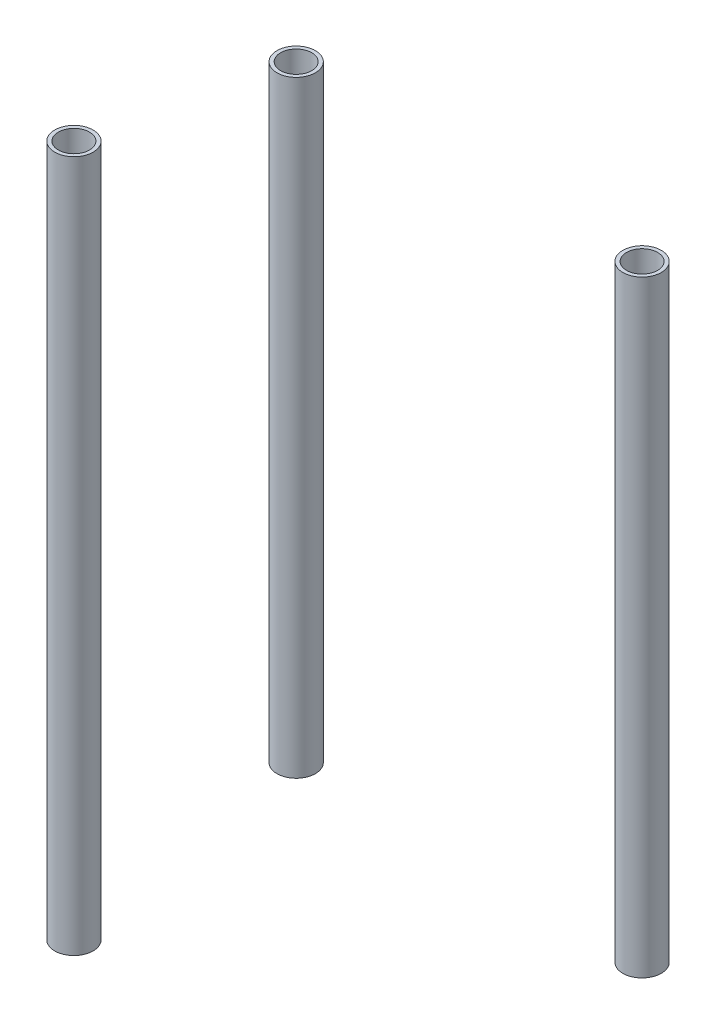
ISO-10303-21;
HEADER;
FILE_DESCRIPTION(('STEP AP214'),'2;1');
FILE_NAME('part.step','',(''),(''),'','','');
FILE_SCHEMA(('AUTOMOTIVE_DESIGN { 1 0 10303 214 1 1 1 1 }'));
ENDSEC;
DATA;
#1=APPLICATION_CONTEXT('core data for automotive mechanical design processes');
#2=APPLICATION_PROTOCOL_DEFINITION('international standard','automotive_design',2000,#1);
#3=PRODUCT_CONTEXT('',#1,'mechanical');
#4=PRODUCT('Part','Part','',(#3));
#5=PRODUCT_RELATED_PRODUCT_CATEGORY('part','',(#4));
#6=PRODUCT_DEFINITION_FORMATION('','',#4);
#7=PRODUCT_DEFINITION_CONTEXT('part definition',#1,'design');
#8=PRODUCT_DEFINITION('design','',#6,#7);
#9=PRODUCT_DEFINITION_SHAPE('','',#8);
#10=(LENGTH_UNIT() NAMED_UNIT(*) SI_UNIT(.MILLI.,.METRE.));
#11=(NAMED_UNIT(*) PLANE_ANGLE_UNIT() SI_UNIT($,.RADIAN.));
#12=(NAMED_UNIT(*) SI_UNIT($,.STERADIAN.) SOLID_ANGLE_UNIT());
#13=UNCERTAINTY_MEASURE_WITH_UNIT(LENGTH_MEASURE(1.E-05),#10,'distance_accuracy_value','');
#14=(GEOMETRIC_REPRESENTATION_CONTEXT(3) GLOBAL_UNCERTAINTY_ASSIGNED_CONTEXT((#13)) GLOBAL_UNIT_ASSIGNED_CONTEXT((#10,
#11,#12)) REPRESENTATION_CONTEXT('',''));
#15=CARTESIAN_POINT('',(0.,0.,0.));
#16=DIRECTION('',(0.,0.,1.));
#17=DIRECTION('',(1.,0.,0.));
#18=AXIS2_PLACEMENT_3D('',#15,#16,#17);
#19=CARTESIAN_POINT('',(-696.777536969202,-200.5838,15.6718));
#20=DIRECTION('',(0.,1.,0.));
#21=DIRECTION('',(0.,0.,1.));
#22=AXIS2_PLACEMENT_3D('',#19,#20,#21);
#23=CYLINDRICAL_SURFACE('',#22,10.287);
#24=CARTESIAN_POINT('',(-696.777536969202,-200.5838,15.6718));
#25=DIRECTION('',(0.,1.,0.));
#26=DIRECTION('',(0.,0.,1.));
#27=AXIS2_PLACEMENT_3D('',#24,#25,#26);
#28=CIRCLE('',#27,10.287);
#29=CARTESIAN_POINT('',(-696.777536969202,-200.5838,25.9588));
#30=VERTEX_POINT('',#29);
#31=EDGE_CURVE('E62',#30,#30,#28,.T.);
#32=CARTESIAN_POINT('',(-696.777536969202,200.5838,15.6718));
#33=DIRECTION('',(0.,1.,0.));
#34=DIRECTION('',(0.,0.,1.));
#35=AXIS2_PLACEMENT_3D('',#32,#33,#34);
#36=CIRCLE('',#35,10.287);
#37=CARTESIAN_POINT('',(-696.777536969202,200.5838,25.9587999999999));
#38=VERTEX_POINT('',#37);
#39=EDGE_CURVE('E68',#38,#38,#36,.T.);
#40=CARTESIAN_POINT('',(-696.777536969202,-200.5838,25.9588));
#41=CARTESIAN_POINT('',(-696.777536969202,-196.404970833333,25.9588));
#42=CARTESIAN_POINT('',(-696.777536969202,-192.226141666667,25.9588));
#43=CARTESIAN_POINT('',(-696.777536969202,-183.868483333333,25.9588));
#44=CARTESIAN_POINT('',(-696.777536969202,-179.689654166667,25.9588));
#45=CARTESIAN_POINT('',(-696.777536969202,-171.331995833333,25.9588));
#46=CARTESIAN_POINT('',(-696.777536969202,-167.153166666667,25.9588));
#47=CARTESIAN_POINT('',(-696.777536969202,-158.795508333333,25.9588));
#48=CARTESIAN_POINT('',(-696.777536969202,-154.616679166667,25.9588));
#49=CARTESIAN_POINT('',(-696.777536969202,-146.259020833333,25.9588));
#50=CARTESIAN_POINT('',(-696.777536969202,-142.080191666667,25.9588));
#51=CARTESIAN_POINT('',(-696.777536969202,-133.722533333333,25.9588));
#52=CARTESIAN_POINT('',(-696.777536969202,-129.543704166667,25.9588));
#53=CARTESIAN_POINT('',(-696.777536969202,-121.186045833333,25.9588));
#54=CARTESIAN_POINT('',(-696.777536969202,-117.007216666667,25.9588));
#55=CARTESIAN_POINT('',(-696.777536969202,-108.649558333333,25.9588));
#56=CARTESIAN_POINT('',(-696.777536969202,-104.470729166667,25.9588));
#57=CARTESIAN_POINT('',(-696.777536969202,-96.1130708333333,25.9588));
#58=CARTESIAN_POINT('',(-696.777536969202,-91.9342416666667,25.9588));
#59=CARTESIAN_POINT('',(-696.777536969202,-83.5765833333333,25.9588));
#60=CARTESIAN_POINT('',(-696.777536969202,-79.3977541666667,25.9588));
#61=CARTESIAN_POINT('',(-696.777536969202,-71.0400958333334,25.9588));
#62=CARTESIAN_POINT('',(-696.777536969202,-66.8612666666667,25.9588));
#63=CARTESIAN_POINT('',(-696.777536969202,-58.5036083333334,25.9588));
#64=CARTESIAN_POINT('',(-696.777536969202,-54.3247791666667,25.9588));
#65=CARTESIAN_POINT('',(-696.777536969202,-45.9671208333334,25.9588));
#66=CARTESIAN_POINT('',(-696.777536969202,-41.7882916666667,25.9588));
#67=CARTESIAN_POINT('',(-696.777536969202,-33.4306333333334,25.9588));
#68=CARTESIAN_POINT('',(-696.777536969202,-29.2518041666667,25.9588));
#69=CARTESIAN_POINT('',(-696.777536969202,-20.8941458333334,25.9588));
#70=CARTESIAN_POINT('',(-696.777536969202,-16.7153166666667,25.9588));
#71=CARTESIAN_POINT('',(-696.777536969202,-8.35765833333339,25.9588));
#72=CARTESIAN_POINT('',(-696.777536969202,-4.17882916666672,25.9588));
#73=CARTESIAN_POINT('',(-696.777536969202,4.17882916666661,25.9588));
#74=CARTESIAN_POINT('',(-696.777536969202,8.35765833333328,25.9588));
#75=CARTESIAN_POINT('',(-696.777536969202,16.7153166666666,25.9588));
#76=CARTESIAN_POINT('',(-696.777536969202,20.8941458333333,25.9588));
#77=CARTESIAN_POINT('',(-696.777536969202,29.2518041666666,25.9588));
#78=CARTESIAN_POINT('',(-696.777536969202,33.4306333333333,25.9588));
#79=CARTESIAN_POINT('',(-696.777536969202,41.7882916666666,25.9588));
#80=CARTESIAN_POINT('',(-696.777536969202,45.9671208333333,25.9588));
#81=CARTESIAN_POINT('',(-696.777536969202,54.3247791666666,25.9588));
#82=CARTESIAN_POINT('',(-696.777536969202,58.5036083333333,25.9588));
#83=CARTESIAN_POINT('',(-696.777536969202,66.8612666666666,25.9588));
#84=CARTESIAN_POINT('',(-696.777536969202,71.0400958333333,25.9588));
#85=CARTESIAN_POINT('',(-696.777536969202,79.3977541666666,25.9588));
#86=CARTESIAN_POINT('',(-696.777536969202,83.5765833333332,25.9588));
#87=CARTESIAN_POINT('',(-696.777536969202,91.9342416666666,25.9588));
#88=CARTESIAN_POINT('',(-696.777536969202,96.1130708333333,25.9588));
#89=CARTESIAN_POINT('',(-696.777536969202,104.470729166667,25.9588));
#90=CARTESIAN_POINT('',(-696.777536969202,108.649558333333,25.9588));
#91=CARTESIAN_POINT('',(-696.777536969202,117.007216666667,25.9588));
#92=CARTESIAN_POINT('',(-696.777536969202,121.186045833333,25.9588));
#93=CARTESIAN_POINT('',(-696.777536969202,129.543704166667,25.9588));
#94=CARTESIAN_POINT('',(-696.777536969202,133.722533333333,25.9588));
#95=CARTESIAN_POINT('',(-696.777536969202,142.080191666667,25.9588));
#96=CARTESIAN_POINT('',(-696.777536969202,146.259020833333,25.9588));
#97=CARTESIAN_POINT('',(-696.777536969202,154.616679166667,25.9588));
#98=CARTESIAN_POINT('',(-696.777536969202,158.795508333333,25.9588));
#99=CARTESIAN_POINT('',(-696.777536969202,167.153166666667,25.9588));
#100=CARTESIAN_POINT('',(-696.777536969202,171.331995833333,25.9588));
#101=CARTESIAN_POINT('',(-696.777536969202,179.689654166667,25.9588));
#102=CARTESIAN_POINT('',(-696.777536969202,183.868483333333,25.9587999999999));
#103=CARTESIAN_POINT('',(-696.777536969202,192.226141666667,25.9587999999999));
#104=CARTESIAN_POINT('',(-696.777536969202,196.404970833333,25.9587999999999));
#105=CARTESIAN_POINT('',(-696.777536969202,200.5838,25.9587999999999));
#106=B_SPLINE_CURVE_WITH_KNOTS('',3,(#40,#41,#42,#43,#44,#45,#46,#47,#48,#49,#50,#51,#52,#53,
#54,#55,#56,#57,#58,#59,#60,#61,#62,#63,#64,#65,#66,#67,#68,#69,#70,#71,#72,#73,#74,#75,#76,#77,
#78,#79,#80,#81,#82,#83,#84,#85,#86,#87,#88,#89,#90,#91,#92,#93,#94,#95,#96,#97,#98,#99,#100,
#101,#102,#103,#104,#105),.UNSPECIFIED.,.F.,.F.,(4,2,2,2,2,2,2,2,2,2,2,2,2,2,2,2,2,2,2,2,2,2,2,
2,2,2,2,2,2,2,2,2,4),(0.,12.5364875,25.072975,37.6094625,50.14595,62.6824375,75.218925,
87.7554125,100.2919,112.8283875,125.364875,137.9013625,150.43785,162.9743375,175.510825,
188.0473125,200.5838,213.1202875,225.656775,238.1932625,250.72975,263.2662375,275.802725,
288.3392125,300.8757,313.4121875,325.948675,338.4851625,351.02165,363.5581375,376.094625,
388.6311125,401.1676),.UNSPECIFIED.);
#107=EDGE_CURVE('BSEAM55',#30,#38,#106,.T.);
#108=ORIENTED_EDGE('',*,*,#31,.F.);
#109=ORIENTED_EDGE('',*,*,#39,.T.);
#110=ORIENTED_EDGE('',*,*,#107,.T.);
#111=ORIENTED_EDGE('',*,*,#107,.F.);
#112=EDGE_LOOP('',(#108,#110,#109,#111));
#113=FACE_BOUND('',#112,.T.);
#114=ADVANCED_FACE('F55',(#113),#23,.F.);
#115=CARTESIAN_POINT('',(-696.777536969202,-200.5838,15.6718));
#116=DIRECTION('',(0.,1.,0.));
#117=DIRECTION('',(0.,0.,1.));
#118=AXIS2_PLACEMENT_3D('',#115,#116,#117);
#119=CYLINDRICAL_SURFACE('',#118,12.7);
#120=CARTESIAN_POINT('',(-696.777536969202,-200.5838,15.6718));
#121=DIRECTION('',(0.,1.,0.));
#122=DIRECTION('',(0.,0.,1.));
#123=AXIS2_PLACEMENT_3D('',#120,#121,#122);
#124=CIRCLE('',#123,12.7);
#125=CARTESIAN_POINT('',(-696.777536969202,-200.5838,28.3718));
#126=VERTEX_POINT('',#125);
#127=EDGE_CURVE('E12',#126,#126,#124,.T.);
#128=CARTESIAN_POINT('',(-696.777536969202,200.5838,15.6718));
#129=DIRECTION('',(0.,1.,0.));
#130=DIRECTION('',(0.,0.,1.));
#131=AXIS2_PLACEMENT_3D('',#128,#129,#130);
#132=CIRCLE('',#131,12.7);
#133=CARTESIAN_POINT('',(-696.777536969202,200.5838,28.3717999999999));
#134=VERTEX_POINT('',#133);
#135=EDGE_CURVE('E58',#134,#134,#132,.T.);
#136=CARTESIAN_POINT('',(-696.777536969202,-200.5838,28.3718));
#137=CARTESIAN_POINT('',(-696.777536969202,-196.404970833333,28.3718));
#138=CARTESIAN_POINT('',(-696.777536969202,-192.226141666667,28.3718));
#139=CARTESIAN_POINT('',(-696.777536969202,-183.868483333333,28.3718));
#140=CARTESIAN_POINT('',(-696.777536969202,-179.689654166667,28.3718));
#141=CARTESIAN_POINT('',(-696.777536969202,-171.331995833333,28.3718));
#142=CARTESIAN_POINT('',(-696.777536969202,-167.153166666667,28.3718));
#143=CARTESIAN_POINT('',(-696.777536969202,-158.795508333333,28.3718));
#144=CARTESIAN_POINT('',(-696.777536969202,-154.616679166667,28.3718));
#145=CARTESIAN_POINT('',(-696.777536969202,-146.259020833333,28.3718));
#146=CARTESIAN_POINT('',(-696.777536969202,-142.080191666667,28.3718));
#147=CARTESIAN_POINT('',(-696.777536969202,-133.722533333333,28.3718));
#148=CARTESIAN_POINT('',(-696.777536969202,-129.543704166667,28.3718));
#149=CARTESIAN_POINT('',(-696.777536969202,-121.186045833333,28.3718));
#150=CARTESIAN_POINT('',(-696.777536969202,-117.007216666667,28.3718));
#151=CARTESIAN_POINT('',(-696.777536969202,-108.649558333333,28.3718));
#152=CARTESIAN_POINT('',(-696.777536969202,-104.470729166667,28.3718));
#153=CARTESIAN_POINT('',(-696.777536969202,-96.1130708333333,28.3718));
#154=CARTESIAN_POINT('',(-696.777536969202,-91.9342416666667,28.3718));
#155=CARTESIAN_POINT('',(-696.777536969202,-83.5765833333333,28.3718));
#156=CARTESIAN_POINT('',(-696.777536969202,-79.3977541666667,28.3718));
#157=CARTESIAN_POINT('',(-696.777536969202,-71.0400958333334,28.3718));
#158=CARTESIAN_POINT('',(-696.777536969202,-66.8612666666667,28.3718));
#159=CARTESIAN_POINT('',(-696.777536969202,-58.5036083333334,28.3718));
#160=CARTESIAN_POINT('',(-696.777536969202,-54.3247791666667,28.3718));
#161=CARTESIAN_POINT('',(-696.777536969202,-45.9671208333334,28.3718));
#162=CARTESIAN_POINT('',(-696.777536969202,-41.7882916666667,28.3718));
#163=CARTESIAN_POINT('',(-696.777536969202,-33.4306333333334,28.3718));
#164=CARTESIAN_POINT('',(-696.777536969202,-29.2518041666667,28.3718));
#165=CARTESIAN_POINT('',(-696.777536969202,-20.8941458333334,28.3718));
#166=CARTESIAN_POINT('',(-696.777536969202,-16.7153166666667,28.3718));
#167=CARTESIAN_POINT('',(-696.777536969202,-8.35765833333339,28.3718));
#168=CARTESIAN_POINT('',(-696.777536969202,-4.17882916666672,28.3718));
#169=CARTESIAN_POINT('',(-696.777536969202,4.17882916666661,28.3718));
#170=CARTESIAN_POINT('',(-696.777536969202,8.35765833333328,28.3718));
#171=CARTESIAN_POINT('',(-696.777536969202,16.7153166666666,28.3718));
#172=CARTESIAN_POINT('',(-696.777536969202,20.8941458333333,28.3718));
#173=CARTESIAN_POINT('',(-696.777536969202,29.2518041666666,28.3718));
#174=CARTESIAN_POINT('',(-696.777536969202,33.4306333333333,28.3718));
#175=CARTESIAN_POINT('',(-696.777536969202,41.7882916666666,28.3718));
#176=CARTESIAN_POINT('',(-696.777536969202,45.9671208333333,28.3718));
#177=CARTESIAN_POINT('',(-696.777536969202,54.3247791666666,28.3718));
#178=CARTESIAN_POINT('',(-696.777536969202,58.5036083333333,28.3718));
#179=CARTESIAN_POINT('',(-696.777536969202,66.8612666666666,28.3718));
#180=CARTESIAN_POINT('',(-696.777536969202,71.0400958333333,28.3718));
#181=CARTESIAN_POINT('',(-696.777536969202,79.3977541666666,28.3718));
#182=CARTESIAN_POINT('',(-696.777536969202,83.5765833333332,28.3718));
#183=CARTESIAN_POINT('',(-696.777536969202,91.9342416666666,28.3718));
#184=CARTESIAN_POINT('',(-696.777536969202,96.1130708333333,28.3718));
#185=CARTESIAN_POINT('',(-696.777536969202,104.470729166667,28.3718));
#186=CARTESIAN_POINT('',(-696.777536969202,108.649558333333,28.3718));
#187=CARTESIAN_POINT('',(-696.777536969202,117.007216666667,28.3718));
#188=CARTESIAN_POINT('',(-696.777536969202,121.186045833333,28.3718));
#189=CARTESIAN_POINT('',(-696.777536969202,129.543704166667,28.3718));
#190=CARTESIAN_POINT('',(-696.777536969202,133.722533333333,28.3718));
#191=CARTESIAN_POINT('',(-696.777536969202,142.080191666667,28.3718));
#192=CARTESIAN_POINT('',(-696.777536969202,146.259020833333,28.3718));
#193=CARTESIAN_POINT('',(-696.777536969202,154.616679166667,28.3718));
#194=CARTESIAN_POINT('',(-696.777536969202,158.795508333333,28.3718));
#195=CARTESIAN_POINT('',(-696.777536969202,167.153166666667,28.3718));
#196=CARTESIAN_POINT('',(-696.777536969202,171.331995833333,28.3718));
#197=CARTESIAN_POINT('',(-696.777536969202,179.689654166667,28.3718));
#198=CARTESIAN_POINT('',(-696.777536969202,183.868483333333,28.3717999999999));
#199=CARTESIAN_POINT('',(-696.777536969202,192.226141666667,28.3717999999999));
#200=CARTESIAN_POINT('',(-696.777536969202,196.404970833333,28.3717999999999));
#201=CARTESIAN_POINT('',(-696.777536969202,200.5838,28.3717999999999));
#202=B_SPLINE_CURVE_WITH_KNOTS('',3,(#136,#137,#138,#139,#140,#141,#142,#143,#144,#145,#146,
#147,#148,#149,#150,#151,#152,#153,#154,#155,#156,#157,#158,#159,#160,#161,#162,#163,#164,#165,
#166,#167,#168,#169,#170,#171,#172,#173,#174,#175,#176,#177,#178,#179,#180,#181,#182,#183,#184,
#185,#186,#187,#188,#189,#190,#191,#192,#193,#194,#195,#196,#197,#198,#199,#200,#201),
.UNSPECIFIED.,.F.,.F.,(4,2,2,2,2,2,2,2,2,2,2,2,2,2,2,2,2,2,2,2,2,2,2,2,2,2,2,2,2,2,2,2,4),(0.,
12.5364875,25.072975,37.6094625,50.14595,62.6824375,75.218925,87.7554125,100.2919,112.8283875,
125.364875,137.9013625,150.43785,162.9743375,175.510825,188.0473125,200.5838,213.1202875,
225.656775,238.1932625,250.72975,263.2662375,275.802725,288.3392125,300.8757,313.4121875,
325.948675,338.4851625,351.02165,363.5581375,376.094625,388.6311125,401.1676),.UNSPECIFIED.);
#203=EDGE_CURVE('BSEAM77',#126,#134,#202,.T.);
#204=ORIENTED_EDGE('',*,*,#127,.T.);
#205=ORIENTED_EDGE('',*,*,#135,.F.);
#206=ORIENTED_EDGE('',*,*,#203,.T.);
#207=ORIENTED_EDGE('',*,*,#203,.F.);
#208=EDGE_LOOP('',(#204,#206,#205,#207));
#209=FACE_BOUND('',#208,.T.);
#210=ADVANCED_FACE('F77',(#209),#119,.T.);
#211=CARTESIAN_POINT('',(-696.777536969202,-200.5838,15.6718));
#212=DIRECTION('',(0.,1.,0.));
#213=DIRECTION('',(0.,0.,1.));
#214=AXIS2_PLACEMENT_3D('',#211,#212,#213);
#215=PLANE('',#214);
#216=ORIENTED_EDGE('',*,*,#31,.T.);
#217=EDGE_LOOP('',(#216));
#218=FACE_BOUND('',#217,.T.);
#219=ORIENTED_EDGE('',*,*,#127,.F.);
#220=EDGE_LOOP('',(#219));
#221=FACE_BOUND('',#220,.T.);
#222=ADVANCED_FACE('F79',(#218,#221),#215,.F.);
#223=CARTESIAN_POINT('',(-696.777536969202,200.5838,15.6718));
#224=DIRECTION('',(0.,1.,0.));
#225=DIRECTION('',(0.,0.,1.));
#226=AXIS2_PLACEMENT_3D('',#223,#224,#225);
#227=PLANE('',#226);
#228=ORIENTED_EDGE('',*,*,#39,.F.);
#229=EDGE_LOOP('',(#228));
#230=FACE_BOUND('',#229,.T.);
#231=ORIENTED_EDGE('',*,*,#135,.T.);
#232=EDGE_LOOP('',(#231));
#233=FACE_BOUND('',#232,.T.);
#234=ADVANCED_FACE('F75',(#230,#233),#227,.T.);
#235=CLOSED_SHELL('',(#114,#210,#222,#234));
#236=MANIFOLD_SOLID_BREP('B2',#235);
#237=CARTESIAN_POINT('',(-468.177536969202,200.5838,15.6718));
#238=DIRECTION('',(0.,-1.,0.));
#239=DIRECTION('',(0.,0.,-1.));
#240=AXIS2_PLACEMENT_3D('',#237,#238,#239);
#241=CYLINDRICAL_SURFACE('',#240,10.287);
#242=CARTESIAN_POINT('',(-468.177536969202,200.5838,15.6718));
#243=DIRECTION('',(0.,1.,0.));
#244=DIRECTION('',(0.,0.,-1.));
#245=AXIS2_PLACEMENT_3D('',#242,#243,#244);
#246=CIRCLE('',#245,10.287);
#247=CARTESIAN_POINT('',(-468.177536969202,200.5838,5.38480000000005));
#248=VERTEX_POINT('',#247);
#249=EDGE_CURVE('E139',#248,#248,#246,.T.);
#250=ORIENTED_EDGE('',*,*,#249,.T.);
#251=EDGE_LOOP('',(#250));
#252=FACE_BOUND('',#251,.T.);
#253=CARTESIAN_POINT('',(-468.177536969202,-200.5838,15.6718));
#254=DIRECTION('',(0.,1.,0.));
#255=DIRECTION('',(0.,0.,-1.));
#256=AXIS2_PLACEMENT_3D('',#253,#254,#255);
#257=CIRCLE('',#256,10.287);
#258=CARTESIAN_POINT('',(-468.177536969202,-200.5838,5.38480000000005));
#259=VERTEX_POINT('',#258);
#260=EDGE_CURVE('E145',#259,#259,#257,.T.);
#261=ORIENTED_EDGE('',*,*,#260,.F.);
#262=EDGE_LOOP('',(#261));
#263=FACE_BOUND('',#262,.T.);
#264=ADVANCED_FACE('F132',(#252,#263),#241,.F.);
#265=CARTESIAN_POINT('',(-468.177536969202,200.5838,15.6718));
#266=DIRECTION('',(0.,-1.,0.));
#267=DIRECTION('',(0.,0.,-1.));
#268=AXIS2_PLACEMENT_3D('',#265,#266,#267);
#269=CYLINDRICAL_SURFACE('',#268,12.7);
#270=CARTESIAN_POINT('',(-468.177536969202,200.5838,15.6718));
#271=DIRECTION('',(0.,1.,0.));
#272=DIRECTION('',(0.,0.,-1.));
#273=AXIS2_PLACEMENT_3D('',#270,#271,#272);
#274=CIRCLE('',#273,12.7);
#275=CARTESIAN_POINT('',(-468.177536969202,200.5838,2.97180000000005));
#276=VERTEX_POINT('',#275);
#277=EDGE_CURVE('E54',#276,#276,#274,.T.);
#278=ORIENTED_EDGE('',*,*,#277,.F.);
#279=EDGE_LOOP('',(#278));
#280=FACE_BOUND('',#279,.T.);
#281=CARTESIAN_POINT('',(-468.177536969202,-200.5838,15.6718));
#282=DIRECTION('',(0.,1.,0.));
#283=DIRECTION('',(0.,0.,-1.));
#284=AXIS2_PLACEMENT_3D('',#281,#282,#283);
#285=CIRCLE('',#284,12.7);
#286=CARTESIAN_POINT('',(-468.177536969202,-200.5838,2.97180000000005));
#287=VERTEX_POINT('',#286);
#288=EDGE_CURVE('E135',#287,#287,#285,.T.);
#289=ORIENTED_EDGE('',*,*,#288,.T.);
#290=EDGE_LOOP('',(#289));
#291=FACE_BOUND('',#290,.T.);
#292=ADVANCED_FACE('F152',(#280,#291),#269,.T.);
#293=CARTESIAN_POINT('',(-468.177536969202,200.5838,15.6718));
#294=DIRECTION('',(0.,1.,0.));
#295=DIRECTION('',(0.,0.,-1.));
#296=AXIS2_PLACEMENT_3D('',#293,#294,#295);
#297=PLANE('',#296);
#298=ORIENTED_EDGE('',*,*,#249,.F.);
#299=EDGE_LOOP('',(#298));
#300=FACE_BOUND('',#299,.T.);
#301=ORIENTED_EDGE('',*,*,#277,.T.);
#302=EDGE_LOOP('',(#301));
#303=FACE_BOUND('',#302,.T.);
#304=ADVANCED_FACE('F156',(#300,#303),#297,.T.);
#305=CARTESIAN_POINT('',(-468.177536969202,-200.5838,15.6718));
#306=DIRECTION('',(0.,1.,0.));
#307=DIRECTION('',(0.,0.,-1.));
#308=AXIS2_PLACEMENT_3D('',#305,#306,#307);
#309=PLANE('',#308);
#310=ORIENTED_EDGE('',*,*,#260,.T.);
#311=EDGE_LOOP('',(#310));
#312=FACE_BOUND('',#311,.T.);
#313=ORIENTED_EDGE('',*,*,#288,.F.);
#314=EDGE_LOOP('',(#313));
#315=FACE_BOUND('',#314,.T.);
#316=ADVANCED_FACE('F154',(#312,#315),#309,.F.);
#317=CLOSED_SHELL('',(#264,#292,#304,#316));
#318=MANIFOLD_SOLID_BREP('B7',#317);
#319=CARTESIAN_POINT('',(-696.777536969202,228.6,162.56));
#320=DIRECTION('',(0.,-1.,0.));
#321=DIRECTION('',(0.,0.,-1.));
#322=AXIS2_PLACEMENT_3D('',#319,#320,#321);
#323=CYLINDRICAL_SURFACE('',#322,10.287);
#324=CARTESIAN_POINT('',(-696.777536969202,228.6,162.56));
#325=DIRECTION('',(0.,1.,0.));
#326=DIRECTION('',(0.,0.,1.));
#327=AXIS2_PLACEMENT_3D('',#324,#325,#326);
#328=CIRCLE('',#327,10.287);
#329=CARTESIAN_POINT('',(-696.777536969202,228.6,172.847));
#330=VERTEX_POINT('',#329);
#331=EDGE_CURVE('E209',#330,#330,#328,.T.);
#332=ORIENTED_EDGE('',*,*,#331,.T.);
#333=EDGE_LOOP('',(#332));
#334=FACE_BOUND('',#333,.T.);
#335=CARTESIAN_POINT('',(-696.777536969202,-228.6,162.56));
#336=DIRECTION('',(0.,1.,0.));
#337=DIRECTION('',(0.,0.,1.));
#338=AXIS2_PLACEMENT_3D('',#335,#336,#337);
#339=CIRCLE('',#338,10.287);
#340=CARTESIAN_POINT('',(-696.777536969202,-228.6,172.847));
#341=VERTEX_POINT('',#340);
#342=EDGE_CURVE('E215',#341,#341,#339,.T.);
#343=ORIENTED_EDGE('',*,*,#342,.F.);
#344=EDGE_LOOP('',(#343));
#345=FACE_BOUND('',#344,.T.);
#346=ADVANCED_FACE('F202',(#334,#345),#323,.F.);
#347=CARTESIAN_POINT('',(-696.777536969202,228.6,162.56));
#348=DIRECTION('',(0.,-1.,0.));
#349=DIRECTION('',(0.,0.,-1.));
#350=AXIS2_PLACEMENT_3D('',#347,#348,#349);
#351=CYLINDRICAL_SURFACE('',#350,12.7);
#352=CARTESIAN_POINT('',(-696.777536969202,228.6,162.56));
#353=DIRECTION('',(0.,1.,0.));
#354=DIRECTION('',(0.,0.,1.));
#355=AXIS2_PLACEMENT_3D('',#352,#353,#354);
#356=CIRCLE('',#355,12.7);
#357=CARTESIAN_POINT('',(-696.777536969202,228.6,175.26));
#358=VERTEX_POINT('',#357);
#359=EDGE_CURVE('E131',#358,#358,#356,.T.);
#360=ORIENTED_EDGE('',*,*,#359,.F.);
#361=EDGE_LOOP('',(#360));
#362=FACE_BOUND('',#361,.T.);
#363=CARTESIAN_POINT('',(-696.777536969202,-228.6,162.56));
#364=DIRECTION('',(0.,1.,0.));
#365=DIRECTION('',(0.,0.,1.));
#366=AXIS2_PLACEMENT_3D('',#363,#364,#365);
#367=CIRCLE('',#366,12.7);
#368=CARTESIAN_POINT('',(-696.777536969202,-228.6,175.26));
#369=VERTEX_POINT('',#368);
#370=EDGE_CURVE('E205',#369,#369,#367,.T.);
#371=ORIENTED_EDGE('',*,*,#370,.T.);
#372=EDGE_LOOP('',(#371));
#373=FACE_BOUND('',#372,.T.);
#374=ADVANCED_FACE('F222',(#362,#373),#351,.T.);
#375=CARTESIAN_POINT('',(-696.777536969202,228.6,162.56));
#376=DIRECTION('',(0.,1.,0.));
#377=DIRECTION('',(0.,0.,1.));
#378=AXIS2_PLACEMENT_3D('',#375,#376,#377);
#379=PLANE('',#378);
#380=ORIENTED_EDGE('',*,*,#331,.F.);
#381=EDGE_LOOP('',(#380));
#382=FACE_BOUND('',#381,.T.);
#383=ORIENTED_EDGE('',*,*,#359,.T.);
#384=EDGE_LOOP('',(#383));
#385=FACE_BOUND('',#384,.T.);
#386=ADVANCED_FACE('F226',(#382,#385),#379,.T.);
#387=CARTESIAN_POINT('',(-696.777536969202,-228.6,162.56));
#388=DIRECTION('',(0.,1.,0.));
#389=DIRECTION('',(0.,0.,1.));
#390=AXIS2_PLACEMENT_3D('',#387,#388,#389);
#391=PLANE('',#390);
#392=ORIENTED_EDGE('',*,*,#342,.T.);
#393=EDGE_LOOP('',(#392));
#394=FACE_BOUND('',#393,.T.);
#395=ORIENTED_EDGE('',*,*,#370,.F.);
#396=EDGE_LOOP('',(#395));
#397=FACE_BOUND('',#396,.T.);
#398=ADVANCED_FACE('F224',(#394,#397),#391,.F.);
#399=CLOSED_SHELL('',(#346,#374,#386,#398));
#400=MANIFOLD_SOLID_BREP('B49',#399);
#401=ADVANCED_BREP_SHAPE_REPRESENTATION('',(#18,#236,#318,#400),#14);
#402=SHAPE_DEFINITION_REPRESENTATION(#9,#401);
ENDSEC;
END-ISO-10303-21;
